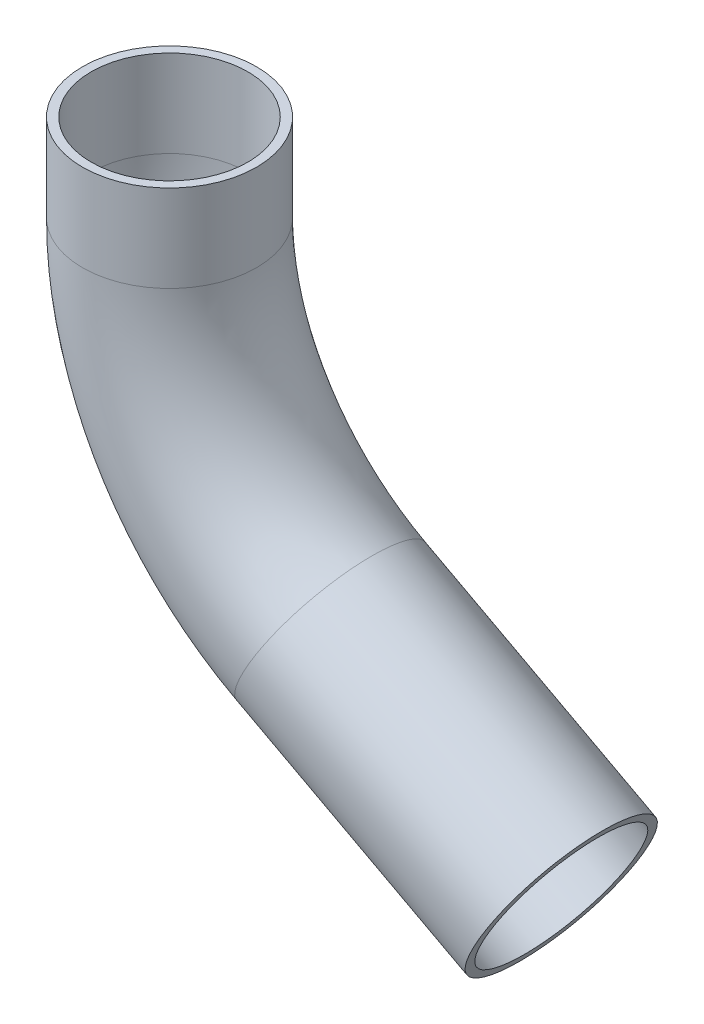
ISO-10303-21;
HEADER;
FILE_DESCRIPTION(('STEP AP214'),'2;1');
FILE_NAME('part.step','',(''),(''),'','','');
FILE_SCHEMA(('AUTOMOTIVE_DESIGN { 1 0 10303 214 1 1 1 1 }'));
ENDSEC;
DATA;
#1=APPLICATION_CONTEXT('core data for automotive mechanical design processes');
#2=APPLICATION_PROTOCOL_DEFINITION('international standard','automotive_design',2000,#1);
#3=PRODUCT_CONTEXT('',#1,'mechanical');
#4=PRODUCT('Part','Part','',(#3));
#5=PRODUCT_RELATED_PRODUCT_CATEGORY('part','',(#4));
#6=PRODUCT_DEFINITION_FORMATION('','',#4);
#7=PRODUCT_DEFINITION_CONTEXT('part definition',#1,'design');
#8=PRODUCT_DEFINITION('design','',#6,#7);
#9=PRODUCT_DEFINITION_SHAPE('','',#8);
#10=(LENGTH_UNIT() NAMED_UNIT(*) SI_UNIT(.MILLI.,.METRE.));
#11=(NAMED_UNIT(*) PLANE_ANGLE_UNIT() SI_UNIT($,.RADIAN.));
#12=(NAMED_UNIT(*) SI_UNIT($,.STERADIAN.) SOLID_ANGLE_UNIT());
#13=UNCERTAINTY_MEASURE_WITH_UNIT(LENGTH_MEASURE(1.E-05),#10,'distance_accuracy_value','');
#14=(GEOMETRIC_REPRESENTATION_CONTEXT(3) GLOBAL_UNCERTAINTY_ASSIGNED_CONTEXT((#13)) GLOBAL_UNIT_ASSIGNED_CONTEXT((#10,
#11,#12)) REPRESENTATION_CONTEXT('',''));
#15=CARTESIAN_POINT('',(0.,0.,0.));
#16=DIRECTION('',(0.,0.,1.));
#17=DIRECTION('',(1.,0.,0.));
#18=AXIS2_PLACEMENT_3D('',#15,#16,#17);
#19=CARTESIAN_POINT('',(0.,0.,0.));
#20=DIRECTION('',(0.,-1.,0.));
#21=DIRECTION('',(0.,0.,-1.));
#22=AXIS2_PLACEMENT_3D('',#19,#20,#21);
#23=CYLINDRICAL_SURFACE('',#22,10.);
#24=CARTESIAN_POINT('',(0.,-10.,0.));
#25=DIRECTION('',(0.,1.,0.));
#26=DIRECTION('',(0.,0.,1.));
#27=AXIS2_PLACEMENT_3D('',#24,#25,#26);
#28=CIRCLE('',#27,10.);
#29=CARTESIAN_POINT('',(-10.,-10.,0.));
#30=VERTEX_POINT('',#29);
#31=EDGE_CURVE('E64',#30,#30,#28,.T.);
#32=ORIENTED_EDGE('',*,*,#31,.T.);
#33=EDGE_LOOP('',(#32));
#34=FACE_BOUND('',#33,.T.);
#35=CARTESIAN_POINT('',(0.,0.,0.));
#36=DIRECTION('',(0.,1.,0.));
#37=DIRECTION('',(0.,0.,1.));
#38=AXIS2_PLACEMENT_3D('',#35,#36,#37);
#39=CIRCLE('',#38,10.);
#40=CARTESIAN_POINT('',(0.,0.,10.));
#41=VERTEX_POINT('',#40);
#42=EDGE_CURVE('E61',#41,#41,#39,.T.);
#43=ORIENTED_EDGE('',*,*,#42,.F.);
#44=EDGE_LOOP('',(#43));
#45=FACE_BOUND('',#44,.T.);
#46=ADVANCED_FACE('F37',(#34,#45),#23,.T.);
#47=CARTESIAN_POINT('',(35.,-10.,0.));
#48=DIRECTION('',(0.,0.,1.));
#49=DIRECTION('',(1.,0.,0.));
#50=AXIS2_PLACEMENT_3D('',#47,#48,#49);
#51=TOROIDAL_SURFACE('',#50,35.,10.);
#52=CARTESIAN_POINT('',(18.5294117647059,-40.8823529411765,0.));
#53=DIRECTION('',(-0.882352941176471,0.470588235294118,0.));
#54=DIRECTION('',(0.,0.,1.));
#55=AXIS2_PLACEMENT_3D('',#52,#53,#54);
#56=CIRCLE('',#55,10.);
#57=CARTESIAN_POINT('',(13.8235294117647,-49.7058823529412,0.));
#58=VERTEX_POINT('',#57);
#59=EDGE_CURVE('E41',#58,#58,#56,.T.);
#60=CARTESIAN_POINT('',(35.,-10.,0.));
#61=DIRECTION('',(0.,0.,1.));
#62=DIRECTION('',(1.,0.,0.));
#63=AXIS2_PLACEMENT_3D('',#60,#61,#62);
#64=CIRCLE('',#63,45.);
#65=EDGE_CURVE('',#30,#58,#64,.T.);
#66=ORIENTED_EDGE('',*,*,#31,.F.);
#67=ORIENTED_EDGE('',*,*,#59,.T.);
#68=ORIENTED_EDGE('',*,*,#65,.T.);
#69=ORIENTED_EDGE('',*,*,#65,.F.);
#70=EDGE_LOOP('',(#66,#68,#67,#69));
#71=FACE_BOUND('',#70,.T.);
#72=ADVANCED_FACE('F73',(#71),#51,.T.);
#73=CARTESIAN_POINT('',(18.5294117647059,-40.8823529411765,0.));
#74=DIRECTION('',(0.88235294117647,-0.470588235294118,0.));
#75=DIRECTION('',(0.470588235294118,0.882352941176471,0.));
#76=AXIS2_PLACEMENT_3D('',#73,#74,#75);
#77=CYLINDRICAL_SURFACE('',#76,10.);
#78=CARTESIAN_POINT('',(45.,-55.,0.));
#79=DIRECTION('',(-0.88235294117647,0.470588235294118,0.));
#80=DIRECTION('',(0.,0.,1.));
#81=AXIS2_PLACEMENT_3D('',#78,#79,#80);
#82=CIRCLE('',#81,10.);
#83=CARTESIAN_POINT('',(45.,-55.,10.));
#84=VERTEX_POINT('',#83);
#85=EDGE_CURVE('E56',#84,#84,#82,.T.);
#86=ORIENTED_EDGE('',*,*,#85,.T.);
#87=EDGE_LOOP('',(#86));
#88=FACE_BOUND('',#87,.T.);
#89=ORIENTED_EDGE('',*,*,#59,.F.);
#90=EDGE_LOOP('',(#89));
#91=FACE_BOUND('',#90,.T.);
#92=ADVANCED_FACE('F39',(#88,#91),#77,.T.);
#93=CARTESIAN_POINT('',(0.,0.,0.));
#94=DIRECTION('',(0.,1.,0.));
#95=DIRECTION('',(0.,0.,1.));
#96=AXIS2_PLACEMENT_3D('',#93,#94,#95);
#97=PLANE('',#96);
#98=CARTESIAN_POINT('',(0.,0.,0.));
#99=DIRECTION('',(0.,1.,0.));
#100=DIRECTION('',(0.,0.,1.));
#101=AXIS2_PLACEMENT_3D('',#98,#99,#100);
#102=CIRCLE('',#101,9.);
#103=CARTESIAN_POINT('',(0.,0.,9.));
#104=VERTEX_POINT('',#103);
#105=EDGE_CURVE('E60',#104,#104,#102,.F.);
#106=ORIENTED_EDGE('',*,*,#105,.T.);
#107=EDGE_LOOP('',(#106));
#108=FACE_BOUND('',#107,.T.);
#109=ORIENTED_EDGE('',*,*,#42,.T.);
#110=EDGE_LOOP('',(#109));
#111=FACE_BOUND('',#110,.T.);
#112=ADVANCED_FACE('F77',(#108,#111),#97,.T.);
#113=CARTESIAN_POINT('',(45.,-55.,0.));
#114=DIRECTION('',(-0.88235294117647,0.470588235294118,0.));
#115=DIRECTION('',(0.,0.,1.));
#116=AXIS2_PLACEMENT_3D('',#113,#114,#115);
#117=PLANE('',#116);
#118=CARTESIAN_POINT('',(45.,-55.,0.));
#119=DIRECTION('',(-0.88235294117647,0.470588235294118,0.));
#120=DIRECTION('',(0.,0.,1.));
#121=AXIS2_PLACEMENT_3D('',#118,#119,#120);
#122=CIRCLE('',#121,9.);
#123=CARTESIAN_POINT('',(45.,-55.,9.));
#124=VERTEX_POINT('',#123);
#125=EDGE_CURVE('E10',#124,#124,#122,.F.);
#126=ORIENTED_EDGE('',*,*,#125,.F.);
#127=EDGE_LOOP('',(#126));
#128=FACE_BOUND('',#127,.T.);
#129=ORIENTED_EDGE('',*,*,#85,.F.);
#130=EDGE_LOOP('',(#129));
#131=FACE_BOUND('',#130,.T.);
#132=ADVANCED_FACE('F83',(#128,#131),#117,.F.);
#133=CARTESIAN_POINT('',(0.,0.,0.));
#134=DIRECTION('',(0.,-1.,0.));
#135=DIRECTION('',(0.,0.,-1.));
#136=AXIS2_PLACEMENT_3D('',#133,#134,#135);
#137=CYLINDRICAL_SURFACE('',#136,9.);
#138=CARTESIAN_POINT('',(0.,-10.,0.));
#139=DIRECTION('',(0.,1.,0.));
#140=DIRECTION('',(0.,0.,1.));
#141=AXIS2_PLACEMENT_3D('',#138,#139,#140);
#142=CIRCLE('',#141,9.);
#143=CARTESIAN_POINT('',(-9.,-10.,0.));
#144=VERTEX_POINT('',#143);
#145=EDGE_CURVE('E52',#144,#144,#142,.F.);
#146=ORIENTED_EDGE('',*,*,#145,.T.);
#147=EDGE_LOOP('',(#146));
#148=FACE_BOUND('',#147,.T.);
#149=ORIENTED_EDGE('',*,*,#105,.F.);
#150=EDGE_LOOP('',(#149));
#151=FACE_BOUND('',#150,.T.);
#152=ADVANCED_FACE('F93',(#148,#151),#137,.F.);
#153=CARTESIAN_POINT('',(35.,-10.,0.));
#154=DIRECTION('',(0.,0.,1.));
#155=DIRECTION('',(1.,0.,0.));
#156=AXIS2_PLACEMENT_3D('',#153,#154,#155);
#157=TOROIDAL_SURFACE('',#156,35.,9.);
#158=CARTESIAN_POINT('',(18.5294117647059,-40.8823529411765,0.));
#159=DIRECTION('',(-0.882352941176471,0.470588235294118,0.));
#160=DIRECTION('',(0.,0.,1.));
#161=AXIS2_PLACEMENT_3D('',#158,#159,#160);
#162=CIRCLE('',#161,9.);
#163=CARTESIAN_POINT('',(14.2941176470588,-48.8235294117647,0.));
#164=VERTEX_POINT('',#163);
#165=EDGE_CURVE('E46',#164,#164,#162,.F.);
#166=CARTESIAN_POINT('',(35.,-10.,0.));
#167=DIRECTION('',(0.,0.,1.));
#168=DIRECTION('',(1.,0.,0.));
#169=AXIS2_PLACEMENT_3D('',#166,#167,#168);
#170=CIRCLE('',#169,44.);
#171=EDGE_CURVE('',#144,#164,#170,.T.);
#172=ORIENTED_EDGE('',*,*,#145,.F.);
#173=ORIENTED_EDGE('',*,*,#165,.T.);
#174=ORIENTED_EDGE('',*,*,#171,.T.);
#175=ORIENTED_EDGE('',*,*,#171,.F.);
#176=EDGE_LOOP('',(#172,#174,#173,#175));
#177=FACE_BOUND('',#176,.T.);
#178=ADVANCED_FACE('F88',(#177),#157,.F.);
#179=CARTESIAN_POINT('',(18.5294117647059,-40.8823529411765,0.));
#180=DIRECTION('',(0.88235294117647,-0.470588235294118,0.));
#181=DIRECTION('',(0.470588235294118,0.882352941176471,0.));
#182=AXIS2_PLACEMENT_3D('',#179,#180,#181);
#183=CYLINDRICAL_SURFACE('',#182,9.);
#184=ORIENTED_EDGE('',*,*,#125,.T.);
#185=EDGE_LOOP('',(#184));
#186=FACE_BOUND('',#185,.T.);
#187=ORIENTED_EDGE('',*,*,#165,.F.);
#188=EDGE_LOOP('',(#187));
#189=FACE_BOUND('',#188,.T.);
#190=ADVANCED_FACE('F86',(#186,#189),#183,.F.);
#191=CLOSED_SHELL('',(#46,#72,#92,#112,#132,#152,#178,#190));
#192=MANIFOLD_SOLID_BREP('B2',#191);
#193=ADVANCED_BREP_SHAPE_REPRESENTATION('',(#18,#192),#14);
#194=SHAPE_DEFINITION_REPRESENTATION(#9,#193);
ENDSEC;
END-ISO-10303-21;
